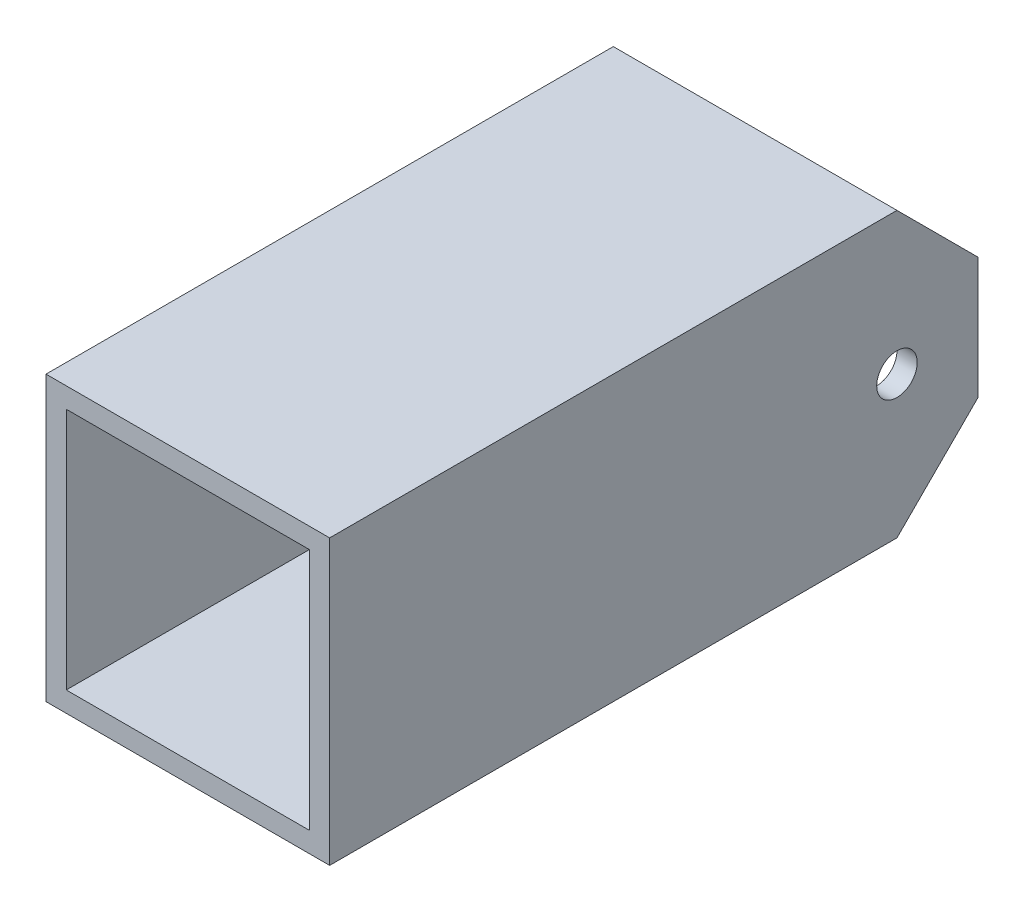
ISO-10303-21;
HEADER;
FILE_DESCRIPTION(('STEP AP214'),'2;1');
FILE_NAME('part.step','',(''),(''),'','','');
FILE_SCHEMA(('AUTOMOTIVE_DESIGN { 1 0 10303 214 1 1 1 1 }'));
ENDSEC;
DATA;
#1=APPLICATION_CONTEXT('core data for automotive mechanical design processes');
#2=APPLICATION_PROTOCOL_DEFINITION('international standard','automotive_design',2000,#1);
#3=PRODUCT_CONTEXT('',#1,'mechanical');
#4=PRODUCT('Part','Part','',(#3));
#5=PRODUCT_RELATED_PRODUCT_CATEGORY('part','',(#4));
#6=PRODUCT_DEFINITION_FORMATION('','',#4);
#7=PRODUCT_DEFINITION_CONTEXT('part definition',#1,'design');
#8=PRODUCT_DEFINITION('design','',#6,#7);
#9=PRODUCT_DEFINITION_SHAPE('','',#8);
#10=(LENGTH_UNIT() NAMED_UNIT(*) SI_UNIT(.MILLI.,.METRE.));
#11=(NAMED_UNIT(*) PLANE_ANGLE_UNIT() SI_UNIT($,.RADIAN.));
#12=(NAMED_UNIT(*) SI_UNIT($,.STERADIAN.) SOLID_ANGLE_UNIT());
#13=UNCERTAINTY_MEASURE_WITH_UNIT(LENGTH_MEASURE(1.E-05),#10,'distance_accuracy_value','');
#14=(GEOMETRIC_REPRESENTATION_CONTEXT(3) GLOBAL_UNCERTAINTY_ASSIGNED_CONTEXT((#13)) GLOBAL_UNIT_ASSIGNED_CONTEXT((#10,
#11,#12)) REPRESENTATION_CONTEXT('',''));
#15=CARTESIAN_POINT('',(0.,0.,0.));
#16=DIRECTION('',(0.,0.,1.));
#17=DIRECTION('',(1.,0.,0.));
#18=AXIS2_PLACEMENT_3D('',#15,#16,#17);
#19=CARTESIAN_POINT('',(0.,0.,0.));
#20=DIRECTION('',(0.,0.,1.));
#21=DIRECTION('',(1.,0.,0.));
#22=AXIS2_PLACEMENT_3D('',#19,#20,#21);
#23=PLANE('',#22);
#24=DIRECTION('',(0.,1.,0.));
#25=VECTOR('',#24,1.);
#26=CARTESIAN_POINT('',(22.225,22.225,0.));
#27=LINE('',#26,#25);
#28=CARTESIAN_POINT('',(22.225,-9.5249999999999,0.));
#29=VERTEX_POINT('',#28);
#30=CARTESIAN_POINT('',(22.225,9.52499999999991,0.));
#31=VERTEX_POINT('',#30);
#32=EDGE_CURVE('E142',#29,#31,#27,.T.);
#33=ORIENTED_EDGE('',*,*,#32,.F.);
#34=DIRECTION('',(-1.,0.,0.));
#35=VECTOR('',#34,1.);
#36=CARTESIAN_POINT('',(0.,-9.52499999999991,0.));
#37=LINE('',#36,#35);
#38=CARTESIAN_POINT('',(19.05,-9.5249999999999,0.));
#39=VERTEX_POINT('',#38);
#40=EDGE_CURVE('E210',#29,#39,#37,.T.);
#41=ORIENTED_EDGE('',*,*,#40,.T.);
#42=DIRECTION('',(0.,1.,0.));
#43=VECTOR('',#42,1.);
#44=CARTESIAN_POINT('',(19.05,19.05,0.));
#45=LINE('',#44,#43);
#46=CARTESIAN_POINT('',(19.05,9.52499999999991,0.));
#47=VERTEX_POINT('',#46);
#48=EDGE_CURVE('E155',#39,#47,#45,.T.);
#49=ORIENTED_EDGE('',*,*,#48,.T.);
#50=DIRECTION('',(1.,0.,0.));
#51=VECTOR('',#50,1.);
#52=CARTESIAN_POINT('',(0.,9.52499999999991,0.));
#53=LINE('',#52,#51);
#54=EDGE_CURVE('E204',#47,#31,#53,.T.);
#55=ORIENTED_EDGE('',*,*,#54,.T.);
#56=EDGE_LOOP('',(#33,#41,#49,#55));
#57=FACE_BOUND('',#56,.T.);
#58=ADVANCED_FACE('F33',(#57),#23,.F.);
#59=CARTESIAN_POINT('',(0.,0.,101.6));
#60=DIRECTION('',(0.,0.,1.));
#61=DIRECTION('',(1.,0.,0.));
#62=AXIS2_PLACEMENT_3D('',#59,#60,#61);
#63=PLANE('',#62);
#64=DIRECTION('',(0.,1.,0.));
#65=VECTOR('',#64,1.);
#66=CARTESIAN_POINT('',(22.225,22.225,101.6));
#67=LINE('',#66,#65);
#68=CARTESIAN_POINT('',(22.225,-22.225,101.6));
#69=VERTEX_POINT('',#68);
#70=CARTESIAN_POINT('',(22.225,22.225,101.6));
#71=VERTEX_POINT('',#70);
#72=EDGE_CURVE('E166',#69,#71,#67,.T.);
#73=ORIENTED_EDGE('',*,*,#72,.T.);
#74=DIRECTION('',(-1.,0.,0.));
#75=VECTOR('',#74,1.);
#76=CARTESIAN_POINT('',(-22.225,22.225,101.6));
#77=LINE('',#76,#75);
#78=CARTESIAN_POINT('',(-22.225,22.225,101.6));
#79=VERTEX_POINT('',#78);
#80=EDGE_CURVE('E169',#71,#79,#77,.T.);
#81=ORIENTED_EDGE('',*,*,#80,.T.);
#82=DIRECTION('',(0.,-1.,0.));
#83=VECTOR('',#82,1.);
#84=CARTESIAN_POINT('',(-22.225,22.225,101.6));
#85=LINE('',#84,#83);
#86=CARTESIAN_POINT('',(-22.225,-22.225,101.6));
#87=VERTEX_POINT('',#86);
#88=EDGE_CURVE('E172',#79,#87,#85,.T.);
#89=ORIENTED_EDGE('',*,*,#88,.T.);
#90=DIRECTION('',(1.,0.,0.));
#91=VECTOR('',#90,1.);
#92=CARTESIAN_POINT('',(-22.225,-22.225,101.6));
#93=LINE('',#92,#91);
#94=EDGE_CURVE('E174',#87,#69,#93,.T.);
#95=ORIENTED_EDGE('',*,*,#94,.T.);
#96=EDGE_LOOP('',(#73,#81,#89,#95));
#97=FACE_BOUND('',#96,.T.);
#98=DIRECTION('',(-1.,0.,0.));
#99=VECTOR('',#98,1.);
#100=CARTESIAN_POINT('',(-19.05,19.05,101.6));
#101=LINE('',#100,#99);
#102=CARTESIAN_POINT('',(19.05,19.05,101.6));
#103=VERTEX_POINT('',#102);
#104=CARTESIAN_POINT('',(-19.05,19.05,101.6));
#105=VERTEX_POINT('',#104);
#106=EDGE_CURVE('E136',#103,#105,#101,.T.);
#107=ORIENTED_EDGE('',*,*,#106,.F.);
#108=DIRECTION('',(0.,1.,0.));
#109=VECTOR('',#108,1.);
#110=CARTESIAN_POINT('',(19.05,19.05,101.6));
#111=LINE('',#110,#109);
#112=CARTESIAN_POINT('',(19.05,-19.05,101.6));
#113=VERTEX_POINT('',#112);
#114=EDGE_CURVE('E125',#113,#103,#111,.T.);
#115=ORIENTED_EDGE('',*,*,#114,.F.);
#116=DIRECTION('',(1.,0.,0.));
#117=VECTOR('',#116,1.);
#118=CARTESIAN_POINT('',(-19.05,-19.05,101.6));
#119=LINE('',#118,#117);
#120=CARTESIAN_POINT('',(-19.05,-19.05,101.6));
#121=VERTEX_POINT('',#120);
#122=EDGE_CURVE('E150',#121,#113,#119,.T.);
#123=ORIENTED_EDGE('',*,*,#122,.F.);
#124=DIRECTION('',(0.,-1.,0.));
#125=VECTOR('',#124,1.);
#126=CARTESIAN_POINT('',(-19.05,19.05,101.6));
#127=LINE('',#126,#125);
#128=EDGE_CURVE('E148',#105,#121,#127,.T.);
#129=ORIENTED_EDGE('',*,*,#128,.F.);
#130=EDGE_LOOP('',(#107,#115,#123,#129));
#131=FACE_BOUND('',#130,.T.);
#132=ADVANCED_FACE('F146',(#97,#131),#63,.T.);
#133=DIRECTION('',(0.,-1.,0.));
#134=VECTOR('',#133,1.);
#135=CARTESIAN_POINT('',(-19.05,19.05,0.));
#136=LINE('',#135,#134);
#137=CARTESIAN_POINT('',(-19.05,9.52499999999991,0.));
#138=VERTEX_POINT('',#137);
#139=CARTESIAN_POINT('',(-19.05,-9.5249999999999,0.));
#140=VERTEX_POINT('',#139);
#141=EDGE_CURVE('E137',#138,#140,#136,.T.);
#142=ORIENTED_EDGE('',*,*,#141,.T.);
#143=DIRECTION('',(-1.,0.,0.));
#144=VECTOR('',#143,1.);
#145=CARTESIAN_POINT('',(0.,-9.52499999999991,0.));
#146=LINE('',#145,#144);
#147=CARTESIAN_POINT('',(-22.225,-9.5249999999999,0.));
#148=VERTEX_POINT('',#147);
#149=EDGE_CURVE('E208',#140,#148,#146,.T.);
#150=ORIENTED_EDGE('',*,*,#149,.T.);
#151=DIRECTION('',(0.,-1.,0.));
#152=VECTOR('',#151,1.);
#153=CARTESIAN_POINT('',(-22.225,22.225,0.));
#154=LINE('',#153,#152);
#155=CARTESIAN_POINT('',(-22.225,9.52499999999991,0.));
#156=VERTEX_POINT('',#155);
#157=EDGE_CURVE('E170',#156,#148,#154,.T.);
#158=ORIENTED_EDGE('',*,*,#157,.F.);
#159=DIRECTION('',(1.,0.,0.));
#160=VECTOR('',#159,1.);
#161=CARTESIAN_POINT('',(0.,9.52499999999991,0.));
#162=LINE('',#161,#160);
#163=EDGE_CURVE('E206',#156,#138,#162,.T.);
#164=ORIENTED_EDGE('',*,*,#163,.T.);
#165=EDGE_LOOP('',(#142,#150,#158,#164));
#166=FACE_BOUND('',#165,.T.);
#167=ADVANCED_FACE('F253',(#166),#23,.F.);
#168=CARTESIAN_POINT('',(22.225,22.225,101.6));
#169=DIRECTION('',(-1.,0.,0.));
#170=DIRECTION('',(0.,-1.,0.));
#171=AXIS2_PLACEMENT_3D('',#168,#169,#170);
#172=PLANE('',#171);
#173=CARTESIAN_POINT('',(22.225,0.,12.7));
#174=DIRECTION('',(-1.,0.,0.));
#175=DIRECTION('',(0.,-1.,0.));
#176=AXIS2_PLACEMENT_3D('',#173,#174,#175);
#177=CIRCLE('',#176,3.175);
#178=CARTESIAN_POINT('',(22.225,-3.175,12.7));
#179=VERTEX_POINT('',#178);
#180=EDGE_CURVE('E158',#179,#179,#177,.T.);
#181=ORIENTED_EDGE('',*,*,#180,.T.);
#182=EDGE_LOOP('',(#181));
#183=FACE_BOUND('',#182,.T.);
#184=DIRECTION('',(0.,0.,-1.));
#185=VECTOR('',#184,1.);
#186=CARTESIAN_POINT('',(22.225,-22.225,101.6));
#187=LINE('',#186,#185);
#188=CARTESIAN_POINT('',(22.225,-22.225,12.7000000000002));
#189=VERTEX_POINT('',#188);
#190=EDGE_CURVE('E176',#69,#189,#187,.T.);
#191=ORIENTED_EDGE('',*,*,#190,.T.);
#192=DIRECTION('',(0.,-0.707106781186544,0.707106781186551));
#193=VECTOR('',#192,1.);
#194=CARTESIAN_POINT('',(22.225,-22.225,12.7000000000002));
#195=LINE('',#194,#193);
#196=EDGE_CURVE('E202',#189,#29,#195,.F.);
#197=ORIENTED_EDGE('',*,*,#196,.T.);
#198=ORIENTED_EDGE('',*,*,#32,.T.);
#199=DIRECTION('',(0.,-0.707106781186544,-0.707106781186551));
#200=VECTOR('',#199,1.);
#201=CARTESIAN_POINT('',(22.225,22.225,12.7000000000002));
#202=LINE('',#201,#200);
#203=CARTESIAN_POINT('',(22.225,22.225,12.7000000000002));
#204=VERTEX_POINT('',#203);
#205=EDGE_CURVE('E200',#31,#204,#202,.F.);
#206=ORIENTED_EDGE('',*,*,#205,.T.);
#207=DIRECTION('',(0.,0.,-1.));
#208=VECTOR('',#207,1.);
#209=CARTESIAN_POINT('',(22.225,22.225,101.6));
#210=LINE('',#209,#208);
#211=EDGE_CURVE('E189',#71,#204,#210,.T.);
#212=ORIENTED_EDGE('',*,*,#211,.F.);
#213=ORIENTED_EDGE('',*,*,#72,.F.);
#214=EDGE_LOOP('',(#191,#197,#198,#206,#212,#213));
#215=FACE_BOUND('',#214,.T.);
#216=ADVANCED_FACE('F238',(#183,#215),#172,.F.);
#217=CARTESIAN_POINT('',(-22.225,22.225,101.6));
#218=DIRECTION('',(0.,-1.,0.));
#219=DIRECTION('',(0.,0.,-1.));
#220=AXIS2_PLACEMENT_3D('',#217,#218,#219);
#221=PLANE('',#220);
#222=ORIENTED_EDGE('',*,*,#211,.T.);
#223=DIRECTION('',(-1.,0.,0.));
#224=VECTOR('',#223,1.);
#225=CARTESIAN_POINT('',(-22.225,22.225,12.7000000000002));
#226=LINE('',#225,#224);
#227=CARTESIAN_POINT('',(-22.225,22.225,12.7000000000002));
#228=VERTEX_POINT('',#227);
#229=EDGE_CURVE('E41',#204,#228,#226,.T.);
#230=ORIENTED_EDGE('',*,*,#229,.T.);
#231=DIRECTION('',(0.,0.,-1.));
#232=VECTOR('',#231,1.);
#233=CARTESIAN_POINT('',(-22.225,22.225,101.6));
#234=LINE('',#233,#232);
#235=EDGE_CURVE('E186',#79,#228,#234,.T.);
#236=ORIENTED_EDGE('',*,*,#235,.F.);
#237=ORIENTED_EDGE('',*,*,#80,.F.);
#238=EDGE_LOOP('',(#222,#230,#236,#237));
#239=FACE_BOUND('',#238,.T.);
#240=ADVANCED_FACE('F225',(#239),#221,.F.);
#241=CARTESIAN_POINT('',(-22.225,22.225,101.6));
#242=DIRECTION('',(1.,0.,0.));
#243=DIRECTION('',(0.,1.,0.));
#244=AXIS2_PLACEMENT_3D('',#241,#242,#243);
#245=PLANE('',#244);
#246=CARTESIAN_POINT('',(-22.225,0.,12.7));
#247=DIRECTION('',(-1.,0.,0.));
#248=DIRECTION('',(0.,-1.,0.));
#249=AXIS2_PLACEMENT_3D('',#246,#247,#248);
#250=CIRCLE('',#249,3.175);
#251=CARTESIAN_POINT('',(-22.225,-3.175,12.7));
#252=VERTEX_POINT('',#251);
#253=EDGE_CURVE('E197',#252,#252,#250,.T.);
#254=ORIENTED_EDGE('',*,*,#253,.F.);
#255=EDGE_LOOP('',(#254));
#256=FACE_BOUND('',#255,.T.);
#257=ORIENTED_EDGE('',*,*,#157,.T.);
#258=DIRECTION('',(0.,0.707106781186544,-0.707106781186551));
#259=VECTOR('',#258,1.);
#260=CARTESIAN_POINT('',(-22.225,-22.225,12.7000000000002));
#261=LINE('',#260,#259);
#262=CARTESIAN_POINT('',(-22.225,-22.225,12.7000000000002));
#263=VERTEX_POINT('',#262);
#264=EDGE_CURVE('E222',#148,#263,#261,.F.);
#265=ORIENTED_EDGE('',*,*,#264,.T.);
#266=DIRECTION('',(0.,0.,-1.));
#267=VECTOR('',#266,1.);
#268=CARTESIAN_POINT('',(-22.225,-22.225,101.6));
#269=LINE('',#268,#267);
#270=EDGE_CURVE('E183',#87,#263,#269,.T.);
#271=ORIENTED_EDGE('',*,*,#270,.F.);
#272=ORIENTED_EDGE('',*,*,#88,.F.);
#273=ORIENTED_EDGE('',*,*,#235,.T.);
#274=DIRECTION('',(0.,0.707106781186544,0.707106781186551));
#275=VECTOR('',#274,1.);
#276=CARTESIAN_POINT('',(-22.225,22.225,12.7000000000002));
#277=LINE('',#276,#275);
#278=EDGE_CURVE('E48',#228,#156,#277,.F.);
#279=ORIENTED_EDGE('',*,*,#278,.T.);
#280=EDGE_LOOP('',(#257,#265,#271,#272,#273,#279));
#281=FACE_BOUND('',#280,.T.);
#282=ADVANCED_FACE('F230',(#256,#281),#245,.F.);
#283=CARTESIAN_POINT('',(-22.225,-22.225,101.6));
#284=DIRECTION('',(0.,1.,0.));
#285=DIRECTION('',(0.,0.,1.));
#286=AXIS2_PLACEMENT_3D('',#283,#284,#285);
#287=PLANE('',#286);
#288=ORIENTED_EDGE('',*,*,#270,.T.);
#289=DIRECTION('',(1.,0.,0.));
#290=VECTOR('',#289,1.);
#291=CARTESIAN_POINT('',(-22.225,-22.225,12.7000000000002));
#292=LINE('',#291,#290);
#293=EDGE_CURVE('E192',#263,#189,#292,.T.);
#294=ORIENTED_EDGE('',*,*,#293,.T.);
#295=ORIENTED_EDGE('',*,*,#190,.F.);
#296=ORIENTED_EDGE('',*,*,#94,.F.);
#297=EDGE_LOOP('',(#288,#294,#295,#296));
#298=FACE_BOUND('',#297,.T.);
#299=ADVANCED_FACE('F257',(#298),#287,.F.);
#300=CARTESIAN_POINT('',(19.05,19.05,101.6));
#301=DIRECTION('',(-1.,0.,0.));
#302=DIRECTION('',(0.,-1.,0.));
#303=AXIS2_PLACEMENT_3D('',#300,#301,#302);
#304=PLANE('',#303);
#305=CARTESIAN_POINT('',(19.05,0.,12.7));
#306=DIRECTION('',(-1.,0.,0.));
#307=DIRECTION('',(0.,-1.,0.));
#308=AXIS2_PLACEMENT_3D('',#305,#306,#307);
#309=CIRCLE('',#308,3.175);
#310=CARTESIAN_POINT('',(19.05,-3.175,12.7));
#311=VERTEX_POINT('',#310);
#312=EDGE_CURVE('E196',#311,#311,#309,.T.);
#313=ORIENTED_EDGE('',*,*,#312,.F.);
#314=EDGE_LOOP('',(#313));
#315=FACE_BOUND('',#314,.T.);
#316=ORIENTED_EDGE('',*,*,#48,.F.);
#317=DIRECTION('',(0.,0.707106781186544,-0.707106781186551));
#318=VECTOR('',#317,1.);
#319=CARTESIAN_POINT('',(19.05,-46.0375000000001,36.5125000000006));
#320=LINE('',#319,#318);
#321=CARTESIAN_POINT('',(19.05,-19.05,9.52500000000019));
#322=VERTEX_POINT('',#321);
#323=EDGE_CURVE('E214',#39,#322,#320,.F.);
#324=ORIENTED_EDGE('',*,*,#323,.T.);
#325=DIRECTION('',(0.,0.,-1.));
#326=VECTOR('',#325,1.);
#327=CARTESIAN_POINT('',(19.05,-19.05,101.6));
#328=LINE('',#327,#326);
#329=EDGE_CURVE('E132',#113,#322,#328,.T.);
#330=ORIENTED_EDGE('',*,*,#329,.F.);
#331=ORIENTED_EDGE('',*,*,#114,.T.);
#332=DIRECTION('',(0.,0.,-1.));
#333=VECTOR('',#332,1.);
#334=CARTESIAN_POINT('',(19.05,19.05,101.6));
#335=LINE('',#334,#333);
#336=CARTESIAN_POINT('',(19.05,19.05,9.5250000000002));
#337=VERTEX_POINT('',#336);
#338=EDGE_CURVE('E129',#103,#337,#335,.T.);
#339=ORIENTED_EDGE('',*,*,#338,.T.);
#340=DIRECTION('',(0.,0.707106781186544,0.707106781186551));
#341=VECTOR('',#340,1.);
#342=CARTESIAN_POINT('',(19.05,65.0874999999999,55.5625000000006));
#343=LINE('',#342,#341);
#344=EDGE_CURVE('E212',#337,#47,#343,.F.);
#345=ORIENTED_EDGE('',*,*,#344,.T.);
#346=EDGE_LOOP('',(#316,#324,#330,#331,#339,#345));
#347=FACE_BOUND('',#346,.T.);
#348=ADVANCED_FACE('F128',(#315,#347),#304,.T.);
#349=CARTESIAN_POINT('',(-19.05,19.05,101.6));
#350=DIRECTION('',(0.,-1.,0.));
#351=DIRECTION('',(0.,0.,-1.));
#352=AXIS2_PLACEMENT_3D('',#349,#350,#351);
#353=PLANE('',#352);
#354=DIRECTION('',(0.,0.,-1.));
#355=VECTOR('',#354,1.);
#356=CARTESIAN_POINT('',(-19.05,19.05,101.6));
#357=LINE('',#356,#355);
#358=CARTESIAN_POINT('',(-19.05,19.05,9.5250000000002));
#359=VERTEX_POINT('',#358);
#360=EDGE_CURVE('E143',#105,#359,#357,.T.);
#361=ORIENTED_EDGE('',*,*,#360,.T.);
#362=DIRECTION('',(-1.,0.,0.));
#363=VECTOR('',#362,1.);
#364=CARTESIAN_POINT('',(-19.05,19.05,9.5250000000002));
#365=LINE('',#364,#363);
#366=EDGE_CURVE('E11',#359,#337,#365,.F.);
#367=ORIENTED_EDGE('',*,*,#366,.T.);
#368=ORIENTED_EDGE('',*,*,#338,.F.);
#369=ORIENTED_EDGE('',*,*,#106,.T.);
#370=EDGE_LOOP('',(#361,#367,#368,#369));
#371=FACE_BOUND('',#370,.T.);
#372=ADVANCED_FACE('F140',(#371),#353,.T.);
#373=CARTESIAN_POINT('',(-19.05,19.05,101.6));
#374=DIRECTION('',(1.,0.,0.));
#375=DIRECTION('',(0.,1.,0.));
#376=AXIS2_PLACEMENT_3D('',#373,#374,#375);
#377=PLANE('',#376);
#378=CARTESIAN_POINT('',(-19.05,0.,12.7));
#379=DIRECTION('',(1.,0.,0.));
#380=DIRECTION('',(0.,1.,0.));
#381=AXIS2_PLACEMENT_3D('',#378,#379,#380);
#382=CIRCLE('',#381,3.175);
#383=CARTESIAN_POINT('',(-19.05,3.175,12.7));
#384=VERTEX_POINT('',#383);
#385=EDGE_CURVE('E193',#384,#384,#382,.T.);
#386=ORIENTED_EDGE('',*,*,#385,.F.);
#387=EDGE_LOOP('',(#386));
#388=FACE_BOUND('',#387,.T.);
#389=DIRECTION('',(0.,0.,-1.));
#390=VECTOR('',#389,1.);
#391=CARTESIAN_POINT('',(-19.05,-19.05,101.6));
#392=LINE('',#391,#390);
#393=CARTESIAN_POINT('',(-19.05,-19.05,9.52500000000019));
#394=VERTEX_POINT('',#393);
#395=EDGE_CURVE('E162',#121,#394,#392,.T.);
#396=ORIENTED_EDGE('',*,*,#395,.T.);
#397=DIRECTION('',(0.,-0.707106781186544,0.707106781186551));
#398=VECTOR('',#397,1.);
#399=CARTESIAN_POINT('',(-19.05,-46.0375000000001,36.5125000000006));
#400=LINE('',#399,#398);
#401=EDGE_CURVE('E219',#394,#140,#400,.F.);
#402=ORIENTED_EDGE('',*,*,#401,.T.);
#403=ORIENTED_EDGE('',*,*,#141,.F.);
#404=DIRECTION('',(0.,-0.707106781186544,-0.707106781186551));
#405=VECTOR('',#404,1.);
#406=CARTESIAN_POINT('',(-19.05,65.0874999999999,55.5625000000006));
#407=LINE('',#406,#405);
#408=EDGE_CURVE('E56',#138,#359,#407,.F.);
#409=ORIENTED_EDGE('',*,*,#408,.T.);
#410=ORIENTED_EDGE('',*,*,#360,.F.);
#411=ORIENTED_EDGE('',*,*,#128,.T.);
#412=EDGE_LOOP('',(#396,#402,#403,#409,#410,#411));
#413=FACE_BOUND('',#412,.T.);
#414=ADVANCED_FACE('F251',(#388,#413),#377,.T.);
#415=CARTESIAN_POINT('',(-19.05,-19.05,101.6));
#416=DIRECTION('',(0.,1.,0.));
#417=DIRECTION('',(0.,0.,1.));
#418=AXIS2_PLACEMENT_3D('',#415,#416,#417);
#419=PLANE('',#418);
#420=ORIENTED_EDGE('',*,*,#329,.T.);
#421=DIRECTION('',(1.,0.,0.));
#422=VECTOR('',#421,1.);
#423=CARTESIAN_POINT('',(-19.05,-19.05,9.52500000000019));
#424=LINE('',#423,#422);
#425=EDGE_CURVE('E216',#322,#394,#424,.F.);
#426=ORIENTED_EDGE('',*,*,#425,.T.);
#427=ORIENTED_EDGE('',*,*,#395,.F.);
#428=ORIENTED_EDGE('',*,*,#122,.T.);
#429=EDGE_LOOP('',(#420,#426,#427,#428));
#430=FACE_BOUND('',#429,.T.);
#431=ADVANCED_FACE('F250',(#430),#419,.T.);
#432=CARTESIAN_POINT('',(32.6390000000001,0.,12.7));
#433=DIRECTION('',(-1.,0.,0.));
#434=DIRECTION('',(0.,-1.,0.));
#435=AXIS2_PLACEMENT_3D('',#432,#433,#434);
#436=CYLINDRICAL_SURFACE('',#435,3.175);
#437=ORIENTED_EDGE('',*,*,#385,.T.);
#438=EDGE_LOOP('',(#437));
#439=FACE_BOUND('',#438,.T.);
#440=ORIENTED_EDGE('',*,*,#253,.T.);
#441=EDGE_LOOP('',(#440));
#442=FACE_BOUND('',#441,.T.);
#443=ADVANCED_FACE('F291',(#439,#442),#436,.F.);
#444=ORIENTED_EDGE('',*,*,#312,.T.);
#445=EDGE_LOOP('',(#444));
#446=FACE_BOUND('',#445,.T.);
#447=ORIENTED_EDGE('',*,*,#180,.F.);
#448=EDGE_LOOP('',(#447));
#449=FACE_BOUND('',#448,.T.);
#450=ADVANCED_FACE('F286',(#446,#449),#436,.F.);
#451=CARTESIAN_POINT('',(-22.225,-22.225,12.7000000000002));
#452=DIRECTION('',(0.,0.707106781186551,0.707106781186544));
#453=DIRECTION('',(1.,0.,0.));
#454=AXIS2_PLACEMENT_3D('',#451,#452,#453);
#455=PLANE('',#454);
#456=ORIENTED_EDGE('',*,*,#323,.F.);
#457=ORIENTED_EDGE('',*,*,#40,.F.);
#458=ORIENTED_EDGE('',*,*,#196,.F.);
#459=ORIENTED_EDGE('',*,*,#293,.F.);
#460=ORIENTED_EDGE('',*,*,#264,.F.);
#461=ORIENTED_EDGE('',*,*,#149,.F.);
#462=ORIENTED_EDGE('',*,*,#401,.F.);
#463=ORIENTED_EDGE('',*,*,#425,.F.);
#464=EDGE_LOOP('',(#456,#457,#458,#459,#460,#461,#462,#463));
#465=FACE_BOUND('',#464,.T.);
#466=ADVANCED_FACE('F246',(#465),#455,.F.);
#467=CARTESIAN_POINT('',(-22.225,22.225,12.7000000000002));
#468=DIRECTION('',(0.,-0.707106781186551,0.707106781186544));
#469=DIRECTION('',(-1.,0.,0.));
#470=AXIS2_PLACEMENT_3D('',#467,#468,#469);
#471=PLANE('',#470);
#472=ORIENTED_EDGE('',*,*,#408,.F.);
#473=ORIENTED_EDGE('',*,*,#163,.F.);
#474=ORIENTED_EDGE('',*,*,#278,.F.);
#475=ORIENTED_EDGE('',*,*,#229,.F.);
#476=ORIENTED_EDGE('',*,*,#205,.F.);
#477=ORIENTED_EDGE('',*,*,#54,.F.);
#478=ORIENTED_EDGE('',*,*,#344,.F.);
#479=ORIENTED_EDGE('',*,*,#366,.F.);
#480=EDGE_LOOP('',(#472,#473,#474,#475,#476,#477,#478,#479));
#481=FACE_BOUND('',#480,.T.);
#482=ADVANCED_FACE('F35',(#481),#471,.F.);
#483=CLOSED_SHELL('',(#58,#132,#167,#216,#240,#282,#299,#348,#372,#414,#431,#443,#450,#466,#482));
#484=MANIFOLD_SOLID_BREP('B2',#483);
#485=ADVANCED_BREP_SHAPE_REPRESENTATION('',(#18,#484),#14);
#486=SHAPE_DEFINITION_REPRESENTATION(#9,#485);
ENDSEC;
END-ISO-10303-21;
